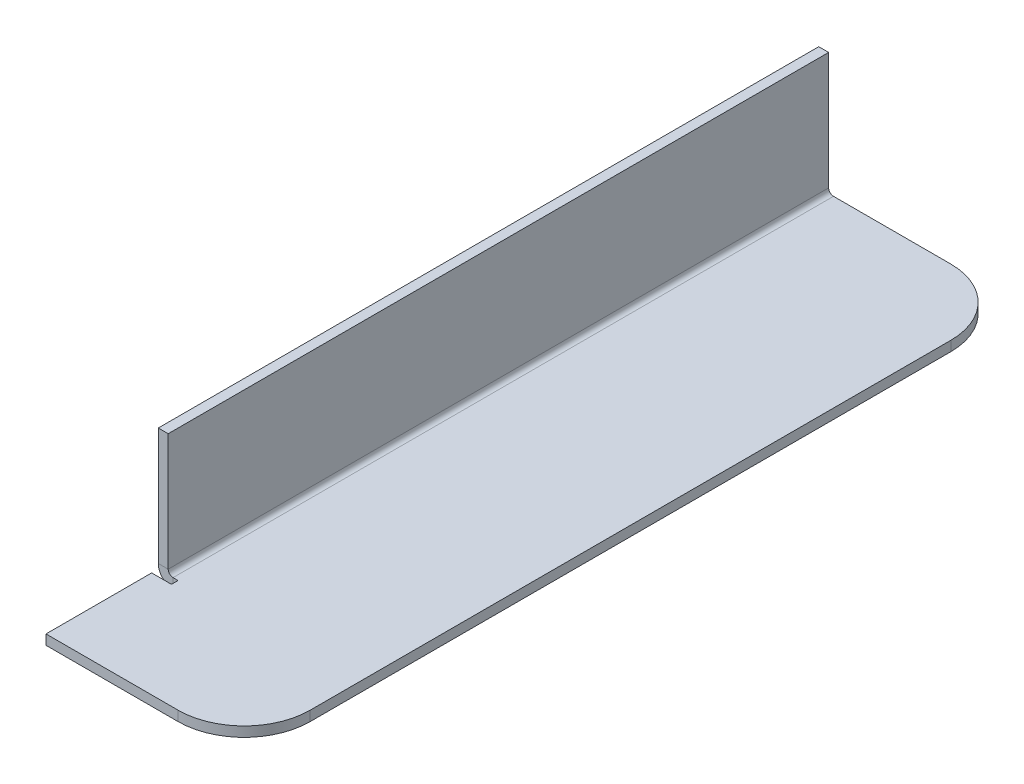
ISO-10303-21;
HEADER;
FILE_DESCRIPTION(('STEP AP214'),'2;1');
FILE_NAME('part.step','',(''),(''),'','','');
FILE_SCHEMA(('AUTOMOTIVE_DESIGN { 1 0 10303 214 1 1 1 1 }'));
ENDSEC;
DATA;
#1=APPLICATION_CONTEXT('core data for automotive mechanical design processes');
#2=APPLICATION_PROTOCOL_DEFINITION('international standard','automotive_design',2000,#1);
#3=PRODUCT_CONTEXT('',#1,'mechanical');
#4=PRODUCT('Part','Part','',(#3));
#5=PRODUCT_RELATED_PRODUCT_CATEGORY('part','',(#4));
#6=PRODUCT_DEFINITION_FORMATION('','',#4);
#7=PRODUCT_DEFINITION_CONTEXT('part definition',#1,'design');
#8=PRODUCT_DEFINITION('design','',#6,#7);
#9=PRODUCT_DEFINITION_SHAPE('','',#8);
#10=(LENGTH_UNIT() NAMED_UNIT(*) SI_UNIT(.MILLI.,.METRE.));
#11=(NAMED_UNIT(*) PLANE_ANGLE_UNIT() SI_UNIT($,.RADIAN.));
#12=(NAMED_UNIT(*) SI_UNIT($,.STERADIAN.) SOLID_ANGLE_UNIT());
#13=UNCERTAINTY_MEASURE_WITH_UNIT(LENGTH_MEASURE(1.E-05),#10,'distance_accuracy_value','');
#14=(GEOMETRIC_REPRESENTATION_CONTEXT(3) GLOBAL_UNCERTAINTY_ASSIGNED_CONTEXT((#13)) GLOBAL_UNIT_ASSIGNED_CONTEXT((#10,
#11,#12)) REPRESENTATION_CONTEXT('',''));
#15=CARTESIAN_POINT('',(0.,0.,0.));
#16=DIRECTION('',(0.,0.,1.));
#17=DIRECTION('',(1.,0.,0.));
#18=AXIS2_PLACEMENT_3D('',#15,#16,#17);
#19=CARTESIAN_POINT('',(5.,-1.5,48.5));
#20=DIRECTION('',(0.,1.,0.));
#21=DIRECTION('',(0.,0.,1.));
#22=AXIS2_PLACEMENT_3D('',#19,#20,#21);
#23=CYLINDRICAL_SURFACE('',#22,10.);
#24=CARTESIAN_POINT('',(5.,-1.5,48.5));
#25=DIRECTION('',(0.,-1.,0.));
#26=DIRECTION('',(0.,0.,-1.));
#27=AXIS2_PLACEMENT_3D('',#24,#25,#26);
#28=CIRCLE('',#27,10.);
#29=CARTESIAN_POINT('',(15.,-1.5,48.5));
#30=VERTEX_POINT('',#29);
#31=CARTESIAN_POINT('',(5.,-1.5,58.5));
#32=VERTEX_POINT('',#31);
#33=EDGE_CURVE('E233',#30,#32,#28,.T.);
#34=ORIENTED_EDGE('',*,*,#33,.F.);
#35=DIRECTION('',(0.,-1.,0.));
#36=VECTOR('',#35,1.);
#37=CARTESIAN_POINT('',(15.,-1.5,48.5));
#38=LINE('',#37,#36);
#39=CARTESIAN_POINT('',(15.,0.,48.5));
#40=VERTEX_POINT('',#39);
#41=EDGE_CURVE('E282',#40,#30,#38,.T.);
#42=ORIENTED_EDGE('',*,*,#41,.F.);
#43=CARTESIAN_POINT('',(5.,0.,48.5));
#44=DIRECTION('',(0.,1.,0.));
#45=DIRECTION('',(0.,0.,-1.));
#46=AXIS2_PLACEMENT_3D('',#43,#44,#45);
#47=CIRCLE('',#46,10.);
#48=CARTESIAN_POINT('',(5.,0.,58.5));
#49=VERTEX_POINT('',#48);
#50=EDGE_CURVE('E265',#49,#40,#47,.T.);
#51=ORIENTED_EDGE('',*,*,#50,.F.);
#52=DIRECTION('',(0.,1.,0.));
#53=VECTOR('',#52,1.);
#54=CARTESIAN_POINT('',(5.,-1.5,58.5));
#55=LINE('',#54,#53);
#56=EDGE_CURVE('E285',#32,#49,#55,.T.);
#57=ORIENTED_EDGE('',*,*,#56,.F.);
#58=EDGE_LOOP('',(#34,#42,#51,#57));
#59=FACE_BOUND('',#58,.T.);
#60=ADVANCED_FACE('F17',(#59),#23,.T.);
#61=CARTESIAN_POINT('',(5.,-1.5,-48.5));
#62=DIRECTION('',(0.,1.,0.));
#63=DIRECTION('',(0.,0.,1.));
#64=AXIS2_PLACEMENT_3D('',#61,#62,#63);
#65=CYLINDRICAL_SURFACE('',#64,10.);
#66=CARTESIAN_POINT('',(5.,-1.5,-48.5));
#67=DIRECTION('',(0.,-1.,0.));
#68=DIRECTION('',(0.,0.,-1.));
#69=AXIS2_PLACEMENT_3D('',#66,#67,#68);
#70=CIRCLE('',#69,10.);
#71=CARTESIAN_POINT('',(5.,-1.5,-58.5));
#72=VERTEX_POINT('',#71);
#73=CARTESIAN_POINT('',(15.,-1.5,-48.5));
#74=VERTEX_POINT('',#73);
#75=EDGE_CURVE('E211',#72,#74,#70,.T.);
#76=ORIENTED_EDGE('',*,*,#75,.F.);
#77=DIRECTION('',(0.,-1.,0.));
#78=VECTOR('',#77,1.);
#79=CARTESIAN_POINT('',(5.,-1.5,-58.5));
#80=LINE('',#79,#78);
#81=CARTESIAN_POINT('',(5.,0.,-58.5));
#82=VERTEX_POINT('',#81);
#83=EDGE_CURVE('E278',#82,#72,#80,.T.);
#84=ORIENTED_EDGE('',*,*,#83,.F.);
#85=CARTESIAN_POINT('',(5.,0.,-48.5));
#86=DIRECTION('',(0.,1.,0.));
#87=DIRECTION('',(0.,0.,-1.));
#88=AXIS2_PLACEMENT_3D('',#85,#86,#87);
#89=CIRCLE('',#88,10.);
#90=CARTESIAN_POINT('',(15.,0.,-48.5));
#91=VERTEX_POINT('',#90);
#92=EDGE_CURVE('E214',#91,#82,#89,.T.);
#93=ORIENTED_EDGE('',*,*,#92,.F.);
#94=DIRECTION('',(0.,1.,0.));
#95=VECTOR('',#94,1.);
#96=CARTESIAN_POINT('',(15.,-1.5,-48.5));
#97=LINE('',#96,#95);
#98=EDGE_CURVE('E269',#74,#91,#97,.T.);
#99=ORIENTED_EDGE('',*,*,#98,.F.);
#100=EDGE_LOOP('',(#76,#84,#93,#99));
#101=FACE_BOUND('',#100,.T.);
#102=ADVANCED_FACE('F363',(#101),#65,.T.);
#103=CARTESIAN_POINT('',(-15.,18.5,-58.5));
#104=DIRECTION('',(0.,-1.,0.));
#105=DIRECTION('',(0.,0.,-1.));
#106=AXIS2_PLACEMENT_3D('',#103,#104,#105);
#107=PLANE('',#106);
#108=DIRECTION('',(0.,0.,-1.));
#109=VECTOR('',#108,1.);
#110=CARTESIAN_POINT('',(-13.5,18.5,-58.5));
#111=LINE('',#110,#109);
#112=CARTESIAN_POINT('',(-13.5,18.5,41.5));
#113=VERTEX_POINT('',#112);
#114=CARTESIAN_POINT('',(-13.5,18.5,-58.5));
#115=VERTEX_POINT('',#114);
#116=EDGE_CURVE('E11',#113,#115,#111,.T.);
#117=ORIENTED_EDGE('',*,*,#116,.T.);
#118=DIRECTION('',(1.,0.,0.));
#119=VECTOR('',#118,1.);
#120=CARTESIAN_POINT('',(-15.,18.5,-58.5));
#121=LINE('',#120,#119);
#122=CARTESIAN_POINT('',(-15.,18.5,-58.5));
#123=VERTEX_POINT('',#122);
#124=EDGE_CURVE('E274',#123,#115,#121,.T.);
#125=ORIENTED_EDGE('',*,*,#124,.F.);
#126=DIRECTION('',(0.,0.,-1.));
#127=VECTOR('',#126,1.);
#128=CARTESIAN_POINT('',(-15.,18.5,0.));
#129=LINE('',#128,#127);
#130=CARTESIAN_POINT('',(-15.,18.5,41.5));
#131=VERTEX_POINT('',#130);
#132=EDGE_CURVE('E25',#131,#123,#129,.T.);
#133=ORIENTED_EDGE('',*,*,#132,.F.);
#134=DIRECTION('',(1.,0.,0.));
#135=VECTOR('',#134,1.);
#136=CARTESIAN_POINT('',(-15.,18.5,41.5));
#137=LINE('',#136,#135);
#138=EDGE_CURVE('E314',#131,#113,#137,.T.);
#139=ORIENTED_EDGE('',*,*,#138,.T.);
#140=EDGE_LOOP('',(#117,#125,#133,#139));
#141=FACE_BOUND('',#140,.T.);
#142=ADVANCED_FACE('F341',(#141),#107,.F.);
#143=CARTESIAN_POINT('',(-13.5,0.,0.));
#144=DIRECTION('',(1.,0.,0.));
#145=DIRECTION('',(0.,1.,0.));
#146=AXIS2_PLACEMENT_3D('',#143,#144,#145);
#147=PLANE('',#146);
#148=DIRECTION('',(0.,1.,0.));
#149=VECTOR('',#148,1.);
#150=CARTESIAN_POINT('',(-13.5,18.5,41.5));
#151=LINE('',#150,#149);
#152=CARTESIAN_POINT('',(-13.5,0.7366,41.5));
#153=VERTEX_POINT('',#152);
#154=EDGE_CURVE('E273',#153,#113,#151,.T.);
#155=ORIENTED_EDGE('',*,*,#154,.F.);
#156=DIRECTION('',(0.,0.,1.));
#157=VECTOR('',#156,1.);
#158=CARTESIAN_POINT('',(-13.5,0.7366,-58.5));
#159=LINE('',#158,#157);
#160=CARTESIAN_POINT('',(-13.5,0.7366,-58.5));
#161=VERTEX_POINT('',#160);
#162=EDGE_CURVE('E160',#161,#153,#159,.T.);
#163=ORIENTED_EDGE('',*,*,#162,.F.);
#164=DIRECTION('',(0.,-1.,0.));
#165=VECTOR('',#164,1.);
#166=CARTESIAN_POINT('',(-13.5,0.,-58.5));
#167=LINE('',#166,#165);
#168=EDGE_CURVE('E270',#115,#161,#167,.T.);
#169=ORIENTED_EDGE('',*,*,#168,.F.);
#170=ORIENTED_EDGE('',*,*,#116,.F.);
#171=EDGE_LOOP('',(#155,#163,#169,#170));
#172=FACE_BOUND('',#171,.T.);
#173=ADVANCED_FACE('F353',(#172),#147,.T.);
#174=CARTESIAN_POINT('',(-15.,0.,0.));
#175=DIRECTION('',(1.,0.,0.));
#176=DIRECTION('',(0.,1.,0.));
#177=AXIS2_PLACEMENT_3D('',#174,#175,#176);
#178=PLANE('',#177);
#179=DIRECTION('',(0.,0.,-1.));
#180=VECTOR('',#179,1.);
#181=CARTESIAN_POINT('',(-15.,0.736599999999992,-58.5));
#182=LINE('',#181,#180);
#183=CARTESIAN_POINT('',(-15.,0.7366,41.5));
#184=VERTEX_POINT('',#183);
#185=CARTESIAN_POINT('',(-15.,0.7366,-58.5));
#186=VERTEX_POINT('',#185);
#187=EDGE_CURVE('E317',#184,#186,#182,.T.);
#188=ORIENTED_EDGE('',*,*,#187,.F.);
#189=DIRECTION('',(0.,1.,0.));
#190=VECTOR('',#189,1.);
#191=CARTESIAN_POINT('',(-15.,0.,41.5));
#192=LINE('',#191,#190);
#193=EDGE_CURVE('E331',#184,#131,#192,.T.);
#194=ORIENTED_EDGE('',*,*,#193,.T.);
#195=ORIENTED_EDGE('',*,*,#132,.T.);
#196=DIRECTION('',(0.,-1.,0.));
#197=VECTOR('',#196,1.);
#198=CARTESIAN_POINT('',(-15.,0.,-58.5));
#199=LINE('',#198,#197);
#200=EDGE_CURVE('E323',#123,#186,#199,.T.);
#201=ORIENTED_EDGE('',*,*,#200,.T.);
#202=EDGE_LOOP('',(#188,#194,#195,#201));
#203=FACE_BOUND('',#202,.T.);
#204=ADVANCED_FACE('F338',(#203),#178,.F.);
#205=CARTESIAN_POINT('',(-15.,18.5,41.5));
#206=DIRECTION('',(0.,0.,-1.));
#207=DIRECTION('',(0.,-1.,0.));
#208=AXIS2_PLACEMENT_3D('',#205,#206,#207);
#209=PLANE('',#208);
#210=DIRECTION('',(-1.,0.,0.));
#211=VECTOR('',#210,1.);
#212=CARTESIAN_POINT('',(-13.5,0.7366,41.5));
#213=LINE('',#212,#211);
#214=EDGE_CURVE('E166',#153,#184,#213,.T.);
#215=ORIENTED_EDGE('',*,*,#214,.F.);
#216=ORIENTED_EDGE('',*,*,#154,.T.);
#217=ORIENTED_EDGE('',*,*,#138,.F.);
#218=ORIENTED_EDGE('',*,*,#193,.F.);
#219=EDGE_LOOP('',(#215,#216,#217,#218));
#220=FACE_BOUND('',#219,.T.);
#221=ADVANCED_FACE('F352',(#220),#209,.F.);
#222=CARTESIAN_POINT('',(-15.,0.,-58.5));
#223=DIRECTION('',(0.,0.,1.));
#224=DIRECTION('',(1.,0.,0.));
#225=AXIS2_PLACEMENT_3D('',#222,#223,#224);
#226=PLANE('',#225);
#227=DIRECTION('',(-1.,0.,0.));
#228=VECTOR('',#227,1.);
#229=CARTESIAN_POINT('',(-15.,0.736599999999992,-58.5));
#230=LINE('',#229,#228);
#231=EDGE_CURVE('E303',#161,#186,#230,.T.);
#232=ORIENTED_EDGE('',*,*,#231,.T.);
#233=ORIENTED_EDGE('',*,*,#200,.F.);
#234=ORIENTED_EDGE('',*,*,#124,.T.);
#235=ORIENTED_EDGE('',*,*,#168,.T.);
#236=EDGE_LOOP('',(#232,#233,#234,#235));
#237=FACE_BOUND('',#236,.T.);
#238=ADVANCED_FACE('F343',(#237),#226,.F.);
#239=CARTESIAN_POINT('',(-12.7634,0.736600000000008,41.5));
#240=DIRECTION('',(0.,0.,1.));
#241=DIRECTION('',(-1.,0.,0.));
#242=AXIS2_PLACEMENT_3D('',#239,#240,#241);
#243=CYLINDRICAL_SURFACE('',#242,0.7366);
#244=DIRECTION('',(0.,0.,-1.));
#245=VECTOR('',#244,1.);
#246=CARTESIAN_POINT('',(-12.7634,0.,41.5));
#247=LINE('',#246,#245);
#248=CARTESIAN_POINT('',(-12.7634,0.,41.5));
#249=VERTEX_POINT('',#248);
#250=CARTESIAN_POINT('',(-12.7634,0.,-58.5));
#251=VERTEX_POINT('',#250);
#252=EDGE_CURVE('E157',#249,#251,#247,.T.);
#253=ORIENTED_EDGE('',*,*,#252,.T.);
#254=CARTESIAN_POINT('',(-12.7634,0.7366,-58.5));
#255=DIRECTION('',(0.,0.,-1.));
#256=DIRECTION('',(0.,-1.,0.));
#257=AXIS2_PLACEMENT_3D('',#254,#255,#256);
#258=CIRCLE('',#257,0.7366);
#259=EDGE_CURVE('E299',#251,#161,#258,.T.);
#260=ORIENTED_EDGE('',*,*,#259,.T.);
#261=ORIENTED_EDGE('',*,*,#162,.T.);
#262=CARTESIAN_POINT('',(-12.7634,0.736600000000008,41.5));
#263=DIRECTION('',(0.,0.,1.));
#264=DIRECTION('',(0.,-1.,0.));
#265=AXIS2_PLACEMENT_3D('',#262,#263,#264);
#266=CIRCLE('',#265,0.7366);
#267=EDGE_CURVE('E153',#153,#249,#266,.T.);
#268=ORIENTED_EDGE('',*,*,#267,.T.);
#269=EDGE_LOOP('',(#253,#260,#261,#268));
#270=FACE_BOUND('',#269,.T.);
#271=ADVANCED_FACE('F155',(#270),#243,.F.);
#272=CARTESIAN_POINT('',(-12.7634,0.736600000000008,41.5));
#273=DIRECTION('',(0.,0.,1.));
#274=DIRECTION('',(-1.,0.,0.));
#275=AXIS2_PLACEMENT_3D('',#272,#273,#274);
#276=CYLINDRICAL_SURFACE('',#275,2.2366);
#277=DIRECTION('',(0.,0.,-1.));
#278=VECTOR('',#277,1.);
#279=CARTESIAN_POINT('',(-12.7634,-1.5,41.5));
#280=LINE('',#279,#278);
#281=CARTESIAN_POINT('',(-12.7634,-1.5,41.5));
#282=VERTEX_POINT('',#281);
#283=CARTESIAN_POINT('',(-12.7634,-1.5,-58.5));
#284=VERTEX_POINT('',#283);
#285=EDGE_CURVE('E218',#282,#284,#280,.T.);
#286=ORIENTED_EDGE('',*,*,#285,.F.);
#287=CARTESIAN_POINT('',(-12.7634,0.736600000000008,41.5));
#288=DIRECTION('',(0.,0.,1.));
#289=DIRECTION('',(0.,-1.,0.));
#290=AXIS2_PLACEMENT_3D('',#287,#288,#289);
#291=CIRCLE('',#290,2.2366);
#292=EDGE_CURVE('E186',#184,#282,#291,.T.);
#293=ORIENTED_EDGE('',*,*,#292,.F.);
#294=ORIENTED_EDGE('',*,*,#187,.T.);
#295=CARTESIAN_POINT('',(-12.7634,0.7366,-58.5));
#296=DIRECTION('',(0.,0.,-1.));
#297=DIRECTION('',(0.,-1.,0.));
#298=AXIS2_PLACEMENT_3D('',#295,#296,#297);
#299=CIRCLE('',#298,2.2366);
#300=EDGE_CURVE('E167',#284,#186,#299,.T.);
#301=ORIENTED_EDGE('',*,*,#300,.F.);
#302=EDGE_LOOP('',(#286,#293,#294,#301));
#303=FACE_BOUND('',#302,.T.);
#304=ADVANCED_FACE('F349',(#303),#276,.T.);
#305=CARTESIAN_POINT('',(-12.7634,0.736600000000008,41.5));
#306=DIRECTION('',(0.,0.,-1.));
#307=DIRECTION('',(0.,-1.,0.));
#308=AXIS2_PLACEMENT_3D('',#305,#306,#307);
#309=PLANE('',#308);
#310=ORIENTED_EDGE('',*,*,#267,.F.);
#311=ORIENTED_EDGE('',*,*,#214,.T.);
#312=ORIENTED_EDGE('',*,*,#292,.T.);
#313=DIRECTION('',(0.,-1.,0.));
#314=VECTOR('',#313,1.);
#315=CARTESIAN_POINT('',(-12.7634,0.,41.5));
#316=LINE('',#315,#314);
#317=EDGE_CURVE('E183',#249,#282,#316,.T.);
#318=ORIENTED_EDGE('',*,*,#317,.F.);
#319=EDGE_LOOP('',(#310,#311,#312,#318));
#320=FACE_BOUND('',#319,.T.);
#321=ADVANCED_FACE('F184',(#320),#309,.F.);
#322=CARTESIAN_POINT('',(-12.7634,0.7366,-58.5));
#323=DIRECTION('',(0.,0.,-1.));
#324=DIRECTION('',(0.,-1.,0.));
#325=AXIS2_PLACEMENT_3D('',#322,#323,#324);
#326=PLANE('',#325);
#327=ORIENTED_EDGE('',*,*,#231,.F.);
#328=ORIENTED_EDGE('',*,*,#259,.F.);
#329=DIRECTION('',(0.,-1.,0.));
#330=VECTOR('',#329,1.);
#331=CARTESIAN_POINT('',(-12.7634,0.,-58.5));
#332=LINE('',#331,#330);
#333=EDGE_CURVE('E295',#251,#284,#332,.T.);
#334=ORIENTED_EDGE('',*,*,#333,.T.);
#335=ORIENTED_EDGE('',*,*,#300,.T.);
#336=EDGE_LOOP('',(#327,#328,#334,#335));
#337=FACE_BOUND('',#336,.T.);
#338=ADVANCED_FACE('F346',(#337),#326,.T.);
#339=CARTESIAN_POINT('',(-15.,-1.5,-58.5));
#340=DIRECTION('',(0.,0.,-1.));
#341=DIRECTION('',(0.,-1.,0.));
#342=AXIS2_PLACEMENT_3D('',#339,#340,#341);
#343=PLANE('',#342);
#344=DIRECTION('',(-1.,0.,0.));
#345=VECTOR('',#344,1.);
#346=CARTESIAN_POINT('',(-15.,0.,-58.5));
#347=LINE('',#346,#345);
#348=EDGE_CURVE('E178',#82,#251,#347,.T.);
#349=ORIENTED_EDGE('',*,*,#348,.F.);
#350=ORIENTED_EDGE('',*,*,#83,.T.);
#351=DIRECTION('',(-1.,0.,0.));
#352=VECTOR('',#351,1.);
#353=CARTESIAN_POINT('',(-15.,-1.5,-58.5));
#354=LINE('',#353,#352);
#355=EDGE_CURVE('E204',#72,#284,#354,.T.);
#356=ORIENTED_EDGE('',*,*,#355,.T.);
#357=ORIENTED_EDGE('',*,*,#333,.F.);
#358=EDGE_LOOP('',(#349,#350,#356,#357));
#359=FACE_BOUND('',#358,.T.);
#360=ADVANCED_FACE('F399',(#359),#343,.T.);
#361=CARTESIAN_POINT('',(-12.,-1.5,41.5));
#362=DIRECTION('',(-1.,0.,0.));
#363=DIRECTION('',(0.,0.,1.));
#364=AXIS2_PLACEMENT_3D('',#361,#362,#363);
#365=PLANE('',#364);
#366=DIRECTION('',(0.,0.,1.));
#367=VECTOR('',#366,1.);
#368=CARTESIAN_POINT('',(-12.,0.,41.5));
#369=LINE('',#368,#367);
#370=CARTESIAN_POINT('',(-12.,0.,41.5));
#371=VERTEX_POINT('',#370);
#372=CARTESIAN_POINT('',(-12.,0.,42.5));
#373=VERTEX_POINT('',#372);
#374=EDGE_CURVE('E180',#371,#373,#369,.T.);
#375=ORIENTED_EDGE('',*,*,#374,.F.);
#376=DIRECTION('',(0.,1.,0.));
#377=VECTOR('',#376,1.);
#378=CARTESIAN_POINT('',(-12.,-1.5,41.5));
#379=LINE('',#378,#377);
#380=CARTESIAN_POINT('',(-12.,-1.5,41.5));
#381=VERTEX_POINT('',#380);
#382=EDGE_CURVE('E196',#381,#371,#379,.T.);
#383=ORIENTED_EDGE('',*,*,#382,.F.);
#384=DIRECTION('',(0.,0.,1.));
#385=VECTOR('',#384,1.);
#386=CARTESIAN_POINT('',(-12.,-1.5,41.5));
#387=LINE('',#386,#385);
#388=CARTESIAN_POINT('',(-12.,-1.5,42.5));
#389=VERTEX_POINT('',#388);
#390=EDGE_CURVE('E225',#381,#389,#387,.T.);
#391=ORIENTED_EDGE('',*,*,#390,.T.);
#392=DIRECTION('',(0.,1.,0.));
#393=VECTOR('',#392,1.);
#394=CARTESIAN_POINT('',(-12.,-1.5,42.5));
#395=LINE('',#394,#393);
#396=EDGE_CURVE('E275',#389,#373,#395,.T.);
#397=ORIENTED_EDGE('',*,*,#396,.T.);
#398=EDGE_LOOP('',(#375,#383,#391,#397));
#399=FACE_BOUND('',#398,.T.);
#400=ADVANCED_FACE('F397',(#399),#365,.T.);
#401=CARTESIAN_POINT('',(-15.,-1.5,42.5));
#402=DIRECTION('',(0.,0.,-1.));
#403=DIRECTION('',(0.,-1.,0.));
#404=AXIS2_PLACEMENT_3D('',#401,#402,#403);
#405=PLANE('',#404);
#406=DIRECTION('',(-1.,0.,0.));
#407=VECTOR('',#406,1.);
#408=CARTESIAN_POINT('',(-15.,0.,42.5));
#409=LINE('',#408,#407);
#410=CARTESIAN_POINT('',(-15.,0.,42.5));
#411=VERTEX_POINT('',#410);
#412=EDGE_CURVE('E242',#373,#411,#409,.T.);
#413=ORIENTED_EDGE('',*,*,#412,.F.);
#414=ORIENTED_EDGE('',*,*,#396,.F.);
#415=DIRECTION('',(-1.,0.,0.));
#416=VECTOR('',#415,1.);
#417=CARTESIAN_POINT('',(-15.,-1.5,42.5));
#418=LINE('',#417,#416);
#419=CARTESIAN_POINT('',(-15.,-1.5,42.5));
#420=VERTEX_POINT('',#419);
#421=EDGE_CURVE('E229',#389,#420,#418,.T.);
#422=ORIENTED_EDGE('',*,*,#421,.T.);
#423=DIRECTION('',(0.,1.,0.));
#424=VECTOR('',#423,1.);
#425=CARTESIAN_POINT('',(-15.,-1.5,42.5));
#426=LINE('',#425,#424);
#427=EDGE_CURVE('E279',#420,#411,#426,.T.);
#428=ORIENTED_EDGE('',*,*,#427,.T.);
#429=EDGE_LOOP('',(#413,#414,#422,#428));
#430=FACE_BOUND('',#429,.T.);
#431=ADVANCED_FACE('F395',(#430),#405,.T.);
#432=CARTESIAN_POINT('',(-15.,-1.5,58.5));
#433=DIRECTION('',(-1.,0.,0.));
#434=DIRECTION('',(0.,1.,0.));
#435=AXIS2_PLACEMENT_3D('',#432,#433,#434);
#436=PLANE('',#435);
#437=DIRECTION('',(0.,0.,1.));
#438=VECTOR('',#437,1.);
#439=CARTESIAN_POINT('',(-15.,0.,58.5));
#440=LINE('',#439,#438);
#441=CARTESIAN_POINT('',(-15.,0.,58.5));
#442=VERTEX_POINT('',#441);
#443=EDGE_CURVE('E246',#411,#442,#440,.T.);
#444=ORIENTED_EDGE('',*,*,#443,.F.);
#445=ORIENTED_EDGE('',*,*,#427,.F.);
#446=DIRECTION('',(0.,0.,1.));
#447=VECTOR('',#446,1.);
#448=CARTESIAN_POINT('',(-15.,-1.5,58.5));
#449=LINE('',#448,#447);
#450=CARTESIAN_POINT('',(-15.,-1.5,58.5));
#451=VERTEX_POINT('',#450);
#452=EDGE_CURVE('E237',#420,#451,#449,.T.);
#453=ORIENTED_EDGE('',*,*,#452,.T.);
#454=DIRECTION('',(0.,1.,0.));
#455=VECTOR('',#454,1.);
#456=CARTESIAN_POINT('',(-15.,-1.5,58.5));
#457=LINE('',#456,#455);
#458=EDGE_CURVE('E288',#451,#442,#457,.T.);
#459=ORIENTED_EDGE('',*,*,#458,.T.);
#460=EDGE_LOOP('',(#444,#445,#453,#459));
#461=FACE_BOUND('',#460,.T.);
#462=ADVANCED_FACE('F392',(#461),#436,.T.);
#463=CARTESIAN_POINT('',(-15.,-1.5,58.5));
#464=DIRECTION('',(0.,0.,1.));
#465=DIRECTION('',(1.,0.,0.));
#466=AXIS2_PLACEMENT_3D('',#463,#464,#465);
#467=PLANE('',#466);
#468=DIRECTION('',(1.,0.,0.));
#469=VECTOR('',#468,1.);
#470=CARTESIAN_POINT('',(-15.,-1.5,58.5));
#471=LINE('',#470,#469);
#472=EDGE_CURVE('E238',#451,#32,#471,.T.);
#473=ORIENTED_EDGE('',*,*,#472,.T.);
#474=ORIENTED_EDGE('',*,*,#56,.T.);
#475=DIRECTION('',(1.,0.,0.));
#476=VECTOR('',#475,1.);
#477=CARTESIAN_POINT('',(-15.,0.,58.5));
#478=LINE('',#477,#476);
#479=EDGE_CURVE('E261',#442,#49,#478,.T.);
#480=ORIENTED_EDGE('',*,*,#479,.F.);
#481=ORIENTED_EDGE('',*,*,#458,.F.);
#482=EDGE_LOOP('',(#473,#474,#480,#481));
#483=FACE_BOUND('',#482,.T.);
#484=ADVANCED_FACE('F388',(#483),#467,.T.);
#485=CARTESIAN_POINT('',(15.,-1.5,58.5));
#486=DIRECTION('',(1.,0.,0.));
#487=DIRECTION('',(0.,1.,0.));
#488=AXIS2_PLACEMENT_3D('',#485,#486,#487);
#489=PLANE('',#488);
#490=DIRECTION('',(0.,0.,-1.));
#491=VECTOR('',#490,1.);
#492=CARTESIAN_POINT('',(15.,-1.5,58.5));
#493=LINE('',#492,#491);
#494=EDGE_CURVE('E222',#30,#74,#493,.T.);
#495=ORIENTED_EDGE('',*,*,#494,.T.);
#496=ORIENTED_EDGE('',*,*,#98,.T.);
#497=DIRECTION('',(0.,0.,-1.));
#498=VECTOR('',#497,1.);
#499=CARTESIAN_POINT('',(15.,0.,58.5));
#500=LINE('',#499,#498);
#501=EDGE_CURVE('E215',#40,#91,#500,.T.);
#502=ORIENTED_EDGE('',*,*,#501,.F.);
#503=ORIENTED_EDGE('',*,*,#41,.T.);
#504=EDGE_LOOP('',(#495,#496,#502,#503));
#505=FACE_BOUND('',#504,.T.);
#506=ADVANCED_FACE('F382',(#505),#489,.T.);
#507=CARTESIAN_POINT('',(0.,0.,0.));
#508=DIRECTION('',(0.,-1.,0.));
#509=DIRECTION('',(0.,0.,-1.));
#510=AXIS2_PLACEMENT_3D('',#507,#508,#509);
#511=PLANE('',#510);
#512=ORIENTED_EDGE('',*,*,#501,.T.);
#513=ORIENTED_EDGE('',*,*,#92,.T.);
#514=ORIENTED_EDGE('',*,*,#348,.T.);
#515=ORIENTED_EDGE('',*,*,#252,.F.);
#516=DIRECTION('',(1.,0.,0.));
#517=VECTOR('',#516,1.);
#518=CARTESIAN_POINT('',(-15.,0.,41.5));
#519=LINE('',#518,#517);
#520=EDGE_CURVE('E175',#249,#371,#519,.T.);
#521=ORIENTED_EDGE('',*,*,#520,.T.);
#522=ORIENTED_EDGE('',*,*,#374,.T.);
#523=ORIENTED_EDGE('',*,*,#412,.T.);
#524=ORIENTED_EDGE('',*,*,#443,.T.);
#525=ORIENTED_EDGE('',*,*,#479,.T.);
#526=ORIENTED_EDGE('',*,*,#50,.T.);
#527=EDGE_LOOP('',(#512,#513,#514,#515,#521,#522,#523,#524,#525,#526));
#528=FACE_BOUND('',#527,.T.);
#529=ADVANCED_FACE('F172',(#528),#511,.F.);
#530=CARTESIAN_POINT('',(0.,-1.5,0.));
#531=DIRECTION('',(0.,-1.,0.));
#532=DIRECTION('',(0.,0.,-1.));
#533=AXIS2_PLACEMENT_3D('',#530,#531,#532);
#534=PLANE('',#533);
#535=ORIENTED_EDGE('',*,*,#355,.F.);
#536=ORIENTED_EDGE('',*,*,#75,.T.);
#537=ORIENTED_EDGE('',*,*,#494,.F.);
#538=ORIENTED_EDGE('',*,*,#33,.T.);
#539=ORIENTED_EDGE('',*,*,#472,.F.);
#540=ORIENTED_EDGE('',*,*,#452,.F.);
#541=ORIENTED_EDGE('',*,*,#421,.F.);
#542=ORIENTED_EDGE('',*,*,#390,.F.);
#543=DIRECTION('',(1.,0.,0.));
#544=VECTOR('',#543,1.);
#545=CARTESIAN_POINT('',(-15.,-1.5,41.5));
#546=LINE('',#545,#544);
#547=EDGE_CURVE('E191',#282,#381,#546,.T.);
#548=ORIENTED_EDGE('',*,*,#547,.F.);
#549=ORIENTED_EDGE('',*,*,#285,.T.);
#550=EDGE_LOOP('',(#535,#536,#537,#538,#539,#540,#541,#542,#548,#549));
#551=FACE_BOUND('',#550,.T.);
#552=ADVANCED_FACE('F379',(#551),#534,.T.);
#553=CARTESIAN_POINT('',(-15.,-1.5,41.5));
#554=DIRECTION('',(0.,0.,1.));
#555=DIRECTION('',(1.,0.,0.));
#556=AXIS2_PLACEMENT_3D('',#553,#554,#555);
#557=PLANE('',#556);
#558=ORIENTED_EDGE('',*,*,#520,.F.);
#559=ORIENTED_EDGE('',*,*,#317,.T.);
#560=ORIENTED_EDGE('',*,*,#547,.T.);
#561=ORIENTED_EDGE('',*,*,#382,.T.);
#562=EDGE_LOOP('',(#558,#559,#560,#561));
#563=FACE_BOUND('',#562,.T.);
#564=ADVANCED_FACE('F194',(#563),#557,.T.);
#565=CLOSED_SHELL('',(#60,#102,#142,#173,#204,#221,#238,#271,#304,#321,#338,#360,#400,#431,#462,
#484,#506,#529,#552,#564));
#566=MANIFOLD_SOLID_BREP('B1',#565);
#567=ADVANCED_BREP_SHAPE_REPRESENTATION('',(#18,#566),#14);
#568=SHAPE_DEFINITION_REPRESENTATION(#9,#567);
ENDSEC;
END-ISO-10303-21;
